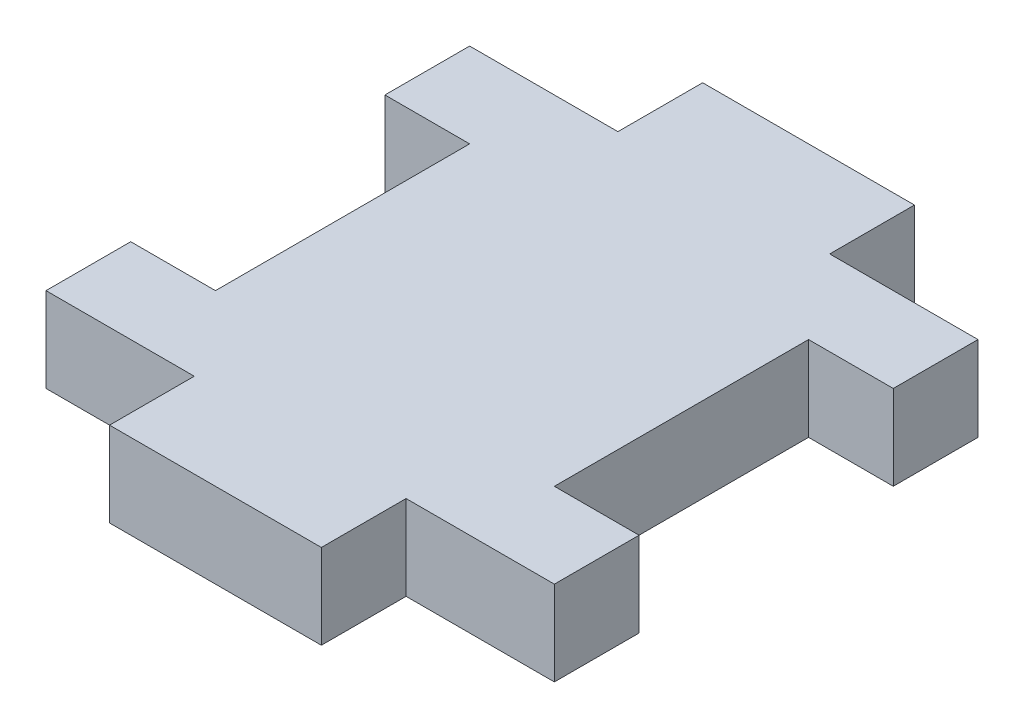
ISO-10303-21;
HEADER;
FILE_DESCRIPTION(('STEP AP214'),'2;1');
FILE_NAME('part.step','',(''),(''),'','','');
FILE_SCHEMA(('AUTOMOTIVE_DESIGN { 1 0 10303 214 1 1 1 1 }'));
ENDSEC;
DATA;
#1=APPLICATION_CONTEXT('core data for automotive mechanical design processes');
#2=APPLICATION_PROTOCOL_DEFINITION('international standard','automotive_design',2000,#1);
#3=PRODUCT_CONTEXT('',#1,'mechanical');
#4=PRODUCT('Part','Part','',(#3));
#5=PRODUCT_RELATED_PRODUCT_CATEGORY('part','',(#4));
#6=PRODUCT_DEFINITION_FORMATION('','',#4);
#7=PRODUCT_DEFINITION_CONTEXT('part definition',#1,'design');
#8=PRODUCT_DEFINITION('design','',#6,#7);
#9=PRODUCT_DEFINITION_SHAPE('','',#8);
#10=(LENGTH_UNIT() NAMED_UNIT(*) SI_UNIT(.MILLI.,.METRE.));
#11=(NAMED_UNIT(*) PLANE_ANGLE_UNIT() SI_UNIT($,.RADIAN.));
#12=(NAMED_UNIT(*) SI_UNIT($,.STERADIAN.) SOLID_ANGLE_UNIT());
#13=UNCERTAINTY_MEASURE_WITH_UNIT(LENGTH_MEASURE(1.E-05),#10,'distance_accuracy_value','');
#14=(GEOMETRIC_REPRESENTATION_CONTEXT(3) GLOBAL_UNCERTAINTY_ASSIGNED_CONTEXT((#13)) GLOBAL_UNIT_ASSIGNED_CONTEXT((#10,
#11,#12)) REPRESENTATION_CONTEXT('',''));
#15=CARTESIAN_POINT('',(0.,0.,0.));
#16=DIRECTION('',(0.,0.,1.));
#17=DIRECTION('',(1.,0.,0.));
#18=AXIS2_PLACEMENT_3D('',#15,#16,#17);
#19=CARTESIAN_POINT('',(-15.875,12.7,-31.75));
#20=DIRECTION('',(1.,0.,0.));
#21=DIRECTION('',(0.,0.,-1.));
#22=AXIS2_PLACEMENT_3D('',#19,#20,#21);
#23=PLANE('',#22);
#24=DIRECTION('',(0.,0.,1.));
#25=VECTOR('',#24,1.);
#26=CARTESIAN_POINT('',(-15.875,0.,-31.75));
#27=LINE('',#26,#25);
#28=CARTESIAN_POINT('',(-15.875,0.,-44.45));
#29=VERTEX_POINT('',#28);
#30=CARTESIAN_POINT('',(-15.875,0.,-31.75));
#31=VERTEX_POINT('',#30);
#32=EDGE_CURVE('E201',#29,#31,#27,.T.);
#33=ORIENTED_EDGE('',*,*,#32,.T.);
#34=DIRECTION('',(0.,-1.,0.));
#35=VECTOR('',#34,1.);
#36=CARTESIAN_POINT('',(-15.875,12.7,-31.75));
#37=LINE('',#36,#35);
#38=CARTESIAN_POINT('',(-15.875,12.7,-31.75));
#39=VERTEX_POINT('',#38);
#40=EDGE_CURVE('E11',#39,#31,#37,.T.);
#41=ORIENTED_EDGE('',*,*,#40,.F.);
#42=DIRECTION('',(0.,0.,1.));
#43=VECTOR('',#42,1.);
#44=CARTESIAN_POINT('',(-15.875,12.7,-31.75));
#45=LINE('',#44,#43);
#46=CARTESIAN_POINT('',(-15.875,12.7,-44.45));
#47=VERTEX_POINT('',#46);
#48=EDGE_CURVE('E239',#47,#39,#45,.T.);
#49=ORIENTED_EDGE('',*,*,#48,.F.);
#50=DIRECTION('',(0.,-1.,0.));
#51=VECTOR('',#50,1.);
#52=CARTESIAN_POINT('',(-15.875,12.7,-44.45));
#53=LINE('',#52,#51);
#54=EDGE_CURVE('E197',#47,#29,#53,.T.);
#55=ORIENTED_EDGE('',*,*,#54,.T.);
#56=EDGE_LOOP('',(#33,#41,#49,#55));
#57=FACE_BOUND('',#56,.T.);
#58=ADVANCED_FACE('F33',(#57),#23,.F.);
#59=CARTESIAN_POINT('',(-15.875,12.7,-31.75));
#60=DIRECTION('',(0.,0.,1.));
#61=DIRECTION('',(1.,0.,0.));
#62=AXIS2_PLACEMENT_3D('',#59,#60,#61);
#63=PLANE('',#62);
#64=DIRECTION('',(-1.,0.,0.));
#65=VECTOR('',#64,1.);
#66=CARTESIAN_POINT('',(-15.875,0.,-31.75));
#67=LINE('',#66,#65);
#68=CARTESIAN_POINT('',(-38.1,0.,-31.75));
#69=VERTEX_POINT('',#68);
#70=EDGE_CURVE('E204',#31,#69,#67,.T.);
#71=ORIENTED_EDGE('',*,*,#70,.T.);
#72=DIRECTION('',(0.,-1.,0.));
#73=VECTOR('',#72,1.);
#74=CARTESIAN_POINT('',(-38.1,12.7,-31.75));
#75=LINE('',#74,#73);
#76=CARTESIAN_POINT('',(-38.1,12.7,-31.75));
#77=VERTEX_POINT('',#76);
#78=EDGE_CURVE('E41',#77,#69,#75,.T.);
#79=ORIENTED_EDGE('',*,*,#78,.F.);
#80=DIRECTION('',(-1.,0.,0.));
#81=VECTOR('',#80,1.);
#82=CARTESIAN_POINT('',(-15.875,12.7,-31.75));
#83=LINE('',#82,#81);
#84=EDGE_CURVE('E128',#39,#77,#83,.T.);
#85=ORIENTED_EDGE('',*,*,#84,.F.);
#86=ORIENTED_EDGE('',*,*,#40,.T.);
#87=EDGE_LOOP('',(#71,#79,#85,#86));
#88=FACE_BOUND('',#87,.T.);
#89=ADVANCED_FACE('F357',(#88),#63,.F.);
#90=CARTESIAN_POINT('',(-38.1,12.7,-19.05));
#91=DIRECTION('',(1.,0.,0.));
#92=DIRECTION('',(0.,0.,-1.));
#93=AXIS2_PLACEMENT_3D('',#90,#91,#92);
#94=PLANE('',#93);
#95=DIRECTION('',(0.,0.,1.));
#96=VECTOR('',#95,1.);
#97=CARTESIAN_POINT('',(-38.1,0.,-19.05));
#98=LINE('',#97,#96);
#99=CARTESIAN_POINT('',(-38.1,0.,-19.05));
#100=VERTEX_POINT('',#99);
#101=EDGE_CURVE('E206',#69,#100,#98,.T.);
#102=ORIENTED_EDGE('',*,*,#101,.T.);
#103=DIRECTION('',(0.,-1.,0.));
#104=VECTOR('',#103,1.);
#105=CARTESIAN_POINT('',(-38.1,12.7,-19.05));
#106=LINE('',#105,#104);
#107=CARTESIAN_POINT('',(-38.1,12.7,-19.05));
#108=VERTEX_POINT('',#107);
#109=EDGE_CURVE('E282',#108,#100,#106,.T.);
#110=ORIENTED_EDGE('',*,*,#109,.F.);
#111=DIRECTION('',(0.,0.,1.));
#112=VECTOR('',#111,1.);
#113=CARTESIAN_POINT('',(-38.1,12.7,-19.05));
#114=LINE('',#113,#112);
#115=EDGE_CURVE('E290',#77,#108,#114,.T.);
#116=ORIENTED_EDGE('',*,*,#115,.F.);
#117=ORIENTED_EDGE('',*,*,#78,.T.);
#118=EDGE_LOOP('',(#102,#110,#116,#117));
#119=FACE_BOUND('',#118,.T.);
#120=ADVANCED_FACE('F288',(#119),#94,.F.);
#121=CARTESIAN_POINT('',(-38.1,12.7,-19.05));
#122=DIRECTION('',(0.,0.,-1.));
#123=DIRECTION('',(-1.,0.,0.));
#124=AXIS2_PLACEMENT_3D('',#121,#122,#123);
#125=PLANE('',#124);
#126=DIRECTION('',(1.,0.,0.));
#127=VECTOR('',#126,1.);
#128=CARTESIAN_POINT('',(-38.1,0.,-19.05));
#129=LINE('',#128,#127);
#130=CARTESIAN_POINT('',(-25.4,0.,-19.05));
#131=VERTEX_POINT('',#130);
#132=EDGE_CURVE('E208',#100,#131,#129,.T.);
#133=ORIENTED_EDGE('',*,*,#132,.T.);
#134=DIRECTION('',(0.,-1.,0.));
#135=VECTOR('',#134,1.);
#136=CARTESIAN_POINT('',(-25.4,12.7,-19.05));
#137=LINE('',#136,#135);
#138=CARTESIAN_POINT('',(-25.4,12.7,-19.05));
#139=VERTEX_POINT('',#138);
#140=EDGE_CURVE('E279',#139,#131,#137,.T.);
#141=ORIENTED_EDGE('',*,*,#140,.F.);
#142=DIRECTION('',(1.,0.,0.));
#143=VECTOR('',#142,1.);
#144=CARTESIAN_POINT('',(-38.1,12.7,-19.05));
#145=LINE('',#144,#143);
#146=EDGE_CURVE('E308',#108,#139,#145,.T.);
#147=ORIENTED_EDGE('',*,*,#146,.F.);
#148=ORIENTED_EDGE('',*,*,#109,.T.);
#149=EDGE_LOOP('',(#133,#141,#147,#148));
#150=FACE_BOUND('',#149,.T.);
#151=ADVANCED_FACE('F299',(#150),#125,.F.);
#152=CARTESIAN_POINT('',(-25.4,12.7,-19.05));
#153=DIRECTION('',(1.,0.,0.));
#154=DIRECTION('',(0.,0.,-1.));
#155=AXIS2_PLACEMENT_3D('',#152,#153,#154);
#156=PLANE('',#155);
#157=DIRECTION('',(0.,0.,1.));
#158=VECTOR('',#157,1.);
#159=CARTESIAN_POINT('',(-25.4,0.,-19.05));
#160=LINE('',#159,#158);
#161=CARTESIAN_POINT('',(-25.4,0.,19.05));
#162=VERTEX_POINT('',#161);
#163=EDGE_CURVE('E210',#131,#162,#160,.T.);
#164=ORIENTED_EDGE('',*,*,#163,.T.);
#165=DIRECTION('',(0.,-1.,0.));
#166=VECTOR('',#165,1.);
#167=CARTESIAN_POINT('',(-25.4,12.7,19.05));
#168=LINE('',#167,#166);
#169=CARTESIAN_POINT('',(-25.4,12.7,19.05));
#170=VERTEX_POINT('',#169);
#171=EDGE_CURVE('E276',#170,#162,#168,.T.);
#172=ORIENTED_EDGE('',*,*,#171,.F.);
#173=DIRECTION('',(0.,0.,1.));
#174=VECTOR('',#173,1.);
#175=CARTESIAN_POINT('',(-25.4,12.7,-19.05));
#176=LINE('',#175,#174);
#177=EDGE_CURVE('E305',#139,#170,#176,.T.);
#178=ORIENTED_EDGE('',*,*,#177,.F.);
#179=ORIENTED_EDGE('',*,*,#140,.T.);
#180=EDGE_LOOP('',(#164,#172,#178,#179));
#181=FACE_BOUND('',#180,.T.);
#182=ADVANCED_FACE('F303',(#181),#156,.F.);
#183=CARTESIAN_POINT('',(-25.4,12.7,19.05));
#184=DIRECTION('',(0.,0.,1.));
#185=DIRECTION('',(1.,0.,0.));
#186=AXIS2_PLACEMENT_3D('',#183,#184,#185);
#187=PLANE('',#186);
#188=DIRECTION('',(-1.,0.,0.));
#189=VECTOR('',#188,1.);
#190=CARTESIAN_POINT('',(-25.4,0.,19.05));
#191=LINE('',#190,#189);
#192=CARTESIAN_POINT('',(-38.1,0.,19.05));
#193=VERTEX_POINT('',#192);
#194=EDGE_CURVE('E212',#162,#193,#191,.T.);
#195=ORIENTED_EDGE('',*,*,#194,.T.);
#196=DIRECTION('',(0.,-1.,0.));
#197=VECTOR('',#196,1.);
#198=CARTESIAN_POINT('',(-38.1,12.7,19.05));
#199=LINE('',#198,#197);
#200=CARTESIAN_POINT('',(-38.1,12.7,19.05));
#201=VERTEX_POINT('',#200);
#202=EDGE_CURVE('E273',#201,#193,#199,.T.);
#203=ORIENTED_EDGE('',*,*,#202,.F.);
#204=DIRECTION('',(-1.,0.,0.));
#205=VECTOR('',#204,1.);
#206=CARTESIAN_POINT('',(-25.4,12.7,19.05));
#207=LINE('',#206,#205);
#208=EDGE_CURVE('E307',#170,#201,#207,.T.);
#209=ORIENTED_EDGE('',*,*,#208,.F.);
#210=ORIENTED_EDGE('',*,*,#171,.T.);
#211=EDGE_LOOP('',(#195,#203,#209,#210));
#212=FACE_BOUND('',#211,.T.);
#213=ADVANCED_FACE('F370',(#212),#187,.F.);
#214=CARTESIAN_POINT('',(-38.1,12.7,31.75));
#215=DIRECTION('',(1.,0.,0.));
#216=DIRECTION('',(0.,0.,-1.));
#217=AXIS2_PLACEMENT_3D('',#214,#215,#216);
#218=PLANE('',#217);
#219=DIRECTION('',(0.,0.,1.));
#220=VECTOR('',#219,1.);
#221=CARTESIAN_POINT('',(-38.1,0.,31.75));
#222=LINE('',#221,#220);
#223=CARTESIAN_POINT('',(-38.1,0.,31.75));
#224=VERTEX_POINT('',#223);
#225=EDGE_CURVE('E214',#193,#224,#222,.T.);
#226=ORIENTED_EDGE('',*,*,#225,.T.);
#227=DIRECTION('',(0.,-1.,0.));
#228=VECTOR('',#227,1.);
#229=CARTESIAN_POINT('',(-38.1,12.7,31.75));
#230=LINE('',#229,#228);
#231=CARTESIAN_POINT('',(-38.1,12.7,31.75));
#232=VERTEX_POINT('',#231);
#233=EDGE_CURVE('E270',#232,#224,#230,.T.);
#234=ORIENTED_EDGE('',*,*,#233,.F.);
#235=DIRECTION('',(0.,0.,1.));
#236=VECTOR('',#235,1.);
#237=CARTESIAN_POINT('',(-38.1,12.7,31.75));
#238=LINE('',#237,#236);
#239=EDGE_CURVE('E310',#201,#232,#238,.T.);
#240=ORIENTED_EDGE('',*,*,#239,.F.);
#241=ORIENTED_EDGE('',*,*,#202,.T.);
#242=EDGE_LOOP('',(#226,#234,#240,#241));
#243=FACE_BOUND('',#242,.T.);
#244=ADVANCED_FACE('F373',(#243),#218,.F.);
#245=CARTESIAN_POINT('',(-15.875,12.7,31.75));
#246=DIRECTION('',(0.,0.,-1.));
#247=DIRECTION('',(-1.,0.,0.));
#248=AXIS2_PLACEMENT_3D('',#245,#246,#247);
#249=PLANE('',#248);
#250=DIRECTION('',(1.,0.,0.));
#251=VECTOR('',#250,1.);
#252=CARTESIAN_POINT('',(-15.875,0.,31.75));
#253=LINE('',#252,#251);
#254=CARTESIAN_POINT('',(-15.875,0.,31.75));
#255=VERTEX_POINT('',#254);
#256=EDGE_CURVE('E216',#224,#255,#253,.T.);
#257=ORIENTED_EDGE('',*,*,#256,.T.);
#258=DIRECTION('',(0.,-1.,0.));
#259=VECTOR('',#258,1.);
#260=CARTESIAN_POINT('',(-15.875,12.7,31.75));
#261=LINE('',#260,#259);
#262=CARTESIAN_POINT('',(-15.875,12.7,31.75));
#263=VERTEX_POINT('',#262);
#264=EDGE_CURVE('E267',#263,#255,#261,.T.);
#265=ORIENTED_EDGE('',*,*,#264,.F.);
#266=DIRECTION('',(1.,0.,0.));
#267=VECTOR('',#266,1.);
#268=CARTESIAN_POINT('',(-15.875,12.7,31.75));
#269=LINE('',#268,#267);
#270=EDGE_CURVE('E316',#232,#263,#269,.T.);
#271=ORIENTED_EDGE('',*,*,#270,.F.);
#272=ORIENTED_EDGE('',*,*,#233,.T.);
#273=EDGE_LOOP('',(#257,#265,#271,#272));
#274=FACE_BOUND('',#273,.T.);
#275=ADVANCED_FACE('F377',(#274),#249,.F.);
#276=CARTESIAN_POINT('',(-15.875,12.7,44.45));
#277=DIRECTION('',(1.,0.,0.));
#278=DIRECTION('',(0.,0.,-1.));
#279=AXIS2_PLACEMENT_3D('',#276,#277,#278);
#280=PLANE('',#279);
#281=DIRECTION('',(0.,0.,1.));
#282=VECTOR('',#281,1.);
#283=CARTESIAN_POINT('',(-15.875,0.,44.45));
#284=LINE('',#283,#282);
#285=CARTESIAN_POINT('',(-15.875,0.,44.45));
#286=VERTEX_POINT('',#285);
#287=EDGE_CURVE('E218',#255,#286,#284,.T.);
#288=ORIENTED_EDGE('',*,*,#287,.T.);
#289=DIRECTION('',(0.,-1.,0.));
#290=VECTOR('',#289,1.);
#291=CARTESIAN_POINT('',(-15.875,12.7,44.45));
#292=LINE('',#291,#290);
#293=CARTESIAN_POINT('',(-15.875,12.7,44.45));
#294=VERTEX_POINT('',#293);
#295=EDGE_CURVE('E264',#294,#286,#292,.T.);
#296=ORIENTED_EDGE('',*,*,#295,.F.);
#297=DIRECTION('',(0.,0.,1.));
#298=VECTOR('',#297,1.);
#299=CARTESIAN_POINT('',(-15.875,12.7,44.45));
#300=LINE('',#299,#298);
#301=EDGE_CURVE('E318',#263,#294,#300,.T.);
#302=ORIENTED_EDGE('',*,*,#301,.F.);
#303=ORIENTED_EDGE('',*,*,#264,.T.);
#304=EDGE_LOOP('',(#288,#296,#302,#303));
#305=FACE_BOUND('',#304,.T.);
#306=ADVANCED_FACE('F381',(#305),#280,.F.);
#307=CARTESIAN_POINT('',(15.875,12.7,44.45));
#308=DIRECTION('',(0.,0.,-1.));
#309=DIRECTION('',(-1.,0.,0.));
#310=AXIS2_PLACEMENT_3D('',#307,#308,#309);
#311=PLANE('',#310);
#312=DIRECTION('',(1.,0.,0.));
#313=VECTOR('',#312,1.);
#314=CARTESIAN_POINT('',(15.875,0.,44.45));
#315=LINE('',#314,#313);
#316=CARTESIAN_POINT('',(15.875,0.,44.45));
#317=VERTEX_POINT('',#316);
#318=EDGE_CURVE('E220',#286,#317,#315,.T.);
#319=ORIENTED_EDGE('',*,*,#318,.T.);
#320=DIRECTION('',(0.,-1.,0.));
#321=VECTOR('',#320,1.);
#322=CARTESIAN_POINT('',(15.875,12.7,44.45));
#323=LINE('',#322,#321);
#324=CARTESIAN_POINT('',(15.875,12.7,44.45));
#325=VERTEX_POINT('',#324);
#326=EDGE_CURVE('E261',#325,#317,#323,.T.);
#327=ORIENTED_EDGE('',*,*,#326,.F.);
#328=DIRECTION('',(1.,0.,0.));
#329=VECTOR('',#328,1.);
#330=CARTESIAN_POINT('',(15.875,12.7,44.45));
#331=LINE('',#330,#329);
#332=EDGE_CURVE('E320',#294,#325,#331,.T.);
#333=ORIENTED_EDGE('',*,*,#332,.F.);
#334=ORIENTED_EDGE('',*,*,#295,.T.);
#335=EDGE_LOOP('',(#319,#327,#333,#334));
#336=FACE_BOUND('',#335,.T.);
#337=ADVANCED_FACE('F385',(#336),#311,.F.);
#338=CARTESIAN_POINT('',(15.875,12.7,44.45));
#339=DIRECTION('',(-1.,0.,0.));
#340=DIRECTION('',(0.,0.,1.));
#341=AXIS2_PLACEMENT_3D('',#338,#339,#340);
#342=PLANE('',#341);
#343=DIRECTION('',(0.,0.,-1.));
#344=VECTOR('',#343,1.);
#345=CARTESIAN_POINT('',(15.875,0.,44.45));
#346=LINE('',#345,#344);
#347=CARTESIAN_POINT('',(15.875,0.,31.75));
#348=VERTEX_POINT('',#347);
#349=EDGE_CURVE('E222',#317,#348,#346,.T.);
#350=ORIENTED_EDGE('',*,*,#349,.T.);
#351=DIRECTION('',(0.,-1.,0.));
#352=VECTOR('',#351,1.);
#353=CARTESIAN_POINT('',(15.875,12.7,31.75));
#354=LINE('',#353,#352);
#355=CARTESIAN_POINT('',(15.875,12.7,31.75));
#356=VERTEX_POINT('',#355);
#357=EDGE_CURVE('E258',#356,#348,#354,.T.);
#358=ORIENTED_EDGE('',*,*,#357,.F.);
#359=DIRECTION('',(0.,0.,-1.));
#360=VECTOR('',#359,1.);
#361=CARTESIAN_POINT('',(15.875,12.7,44.45));
#362=LINE('',#361,#360);
#363=EDGE_CURVE('E322',#325,#356,#362,.T.);
#364=ORIENTED_EDGE('',*,*,#363,.F.);
#365=ORIENTED_EDGE('',*,*,#326,.T.);
#366=EDGE_LOOP('',(#350,#358,#364,#365));
#367=FACE_BOUND('',#366,.T.);
#368=ADVANCED_FACE('F389',(#367),#342,.F.);
#369=CARTESIAN_POINT('',(38.1,12.7,31.75));
#370=DIRECTION('',(0.,0.,-1.));
#371=DIRECTION('',(-1.,0.,0.));
#372=AXIS2_PLACEMENT_3D('',#369,#370,#371);
#373=PLANE('',#372);
#374=DIRECTION('',(1.,0.,0.));
#375=VECTOR('',#374,1.);
#376=CARTESIAN_POINT('',(38.1,0.,31.75));
#377=LINE('',#376,#375);
#378=CARTESIAN_POINT('',(38.1,0.,31.75));
#379=VERTEX_POINT('',#378);
#380=EDGE_CURVE('E224',#348,#379,#377,.T.);
#381=ORIENTED_EDGE('',*,*,#380,.T.);
#382=DIRECTION('',(0.,-1.,0.));
#383=VECTOR('',#382,1.);
#384=CARTESIAN_POINT('',(38.1,12.7,31.75));
#385=LINE('',#384,#383);
#386=CARTESIAN_POINT('',(38.1,12.7,31.75));
#387=VERTEX_POINT('',#386);
#388=EDGE_CURVE('E255',#387,#379,#385,.T.);
#389=ORIENTED_EDGE('',*,*,#388,.F.);
#390=DIRECTION('',(1.,0.,0.));
#391=VECTOR('',#390,1.);
#392=CARTESIAN_POINT('',(38.1,12.7,31.75));
#393=LINE('',#392,#391);
#394=EDGE_CURVE('E324',#356,#387,#393,.T.);
#395=ORIENTED_EDGE('',*,*,#394,.F.);
#396=ORIENTED_EDGE('',*,*,#357,.T.);
#397=EDGE_LOOP('',(#381,#389,#395,#396));
#398=FACE_BOUND('',#397,.T.);
#399=ADVANCED_FACE('F393',(#398),#373,.F.);
#400=CARTESIAN_POINT('',(38.1,12.7,31.75));
#401=DIRECTION('',(-1.,0.,0.));
#402=DIRECTION('',(0.,0.,1.));
#403=AXIS2_PLACEMENT_3D('',#400,#401,#402);
#404=PLANE('',#403);
#405=DIRECTION('',(0.,0.,-1.));
#406=VECTOR('',#405,1.);
#407=CARTESIAN_POINT('',(38.1,0.,31.75));
#408=LINE('',#407,#406);
#409=CARTESIAN_POINT('',(38.1,0.,19.05));
#410=VERTEX_POINT('',#409);
#411=EDGE_CURVE('E226',#379,#410,#408,.T.);
#412=ORIENTED_EDGE('',*,*,#411,.T.);
#413=DIRECTION('',(0.,-1.,0.));
#414=VECTOR('',#413,1.);
#415=CARTESIAN_POINT('',(38.1,12.7,19.05));
#416=LINE('',#415,#414);
#417=CARTESIAN_POINT('',(38.1,12.7,19.05));
#418=VERTEX_POINT('',#417);
#419=EDGE_CURVE('E252',#418,#410,#416,.T.);
#420=ORIENTED_EDGE('',*,*,#419,.F.);
#421=DIRECTION('',(0.,0.,-1.));
#422=VECTOR('',#421,1.);
#423=CARTESIAN_POINT('',(38.1,12.7,31.75));
#424=LINE('',#423,#422);
#425=EDGE_CURVE('E326',#387,#418,#424,.T.);
#426=ORIENTED_EDGE('',*,*,#425,.F.);
#427=ORIENTED_EDGE('',*,*,#388,.T.);
#428=EDGE_LOOP('',(#412,#420,#426,#427));
#429=FACE_BOUND('',#428,.T.);
#430=ADVANCED_FACE('F397',(#429),#404,.F.);
#431=CARTESIAN_POINT('',(25.4,12.7,19.05));
#432=DIRECTION('',(0.,0.,1.));
#433=DIRECTION('',(1.,0.,0.));
#434=AXIS2_PLACEMENT_3D('',#431,#432,#433);
#435=PLANE('',#434);
#436=DIRECTION('',(-1.,0.,0.));
#437=VECTOR('',#436,1.);
#438=CARTESIAN_POINT('',(25.4,0.,19.05));
#439=LINE('',#438,#437);
#440=CARTESIAN_POINT('',(25.4,0.,19.05));
#441=VERTEX_POINT('',#440);
#442=EDGE_CURVE('E228',#410,#441,#439,.T.);
#443=ORIENTED_EDGE('',*,*,#442,.T.);
#444=DIRECTION('',(0.,-1.,0.));
#445=VECTOR('',#444,1.);
#446=CARTESIAN_POINT('',(25.4,12.7,19.05));
#447=LINE('',#446,#445);
#448=CARTESIAN_POINT('',(25.4,12.7,19.05));
#449=VERTEX_POINT('',#448);
#450=EDGE_CURVE('E249',#449,#441,#447,.T.);
#451=ORIENTED_EDGE('',*,*,#450,.F.);
#452=DIRECTION('',(-1.,0.,0.));
#453=VECTOR('',#452,1.);
#454=CARTESIAN_POINT('',(25.4,12.7,19.05));
#455=LINE('',#454,#453);
#456=EDGE_CURVE('E328',#418,#449,#455,.T.);
#457=ORIENTED_EDGE('',*,*,#456,.F.);
#458=ORIENTED_EDGE('',*,*,#419,.T.);
#459=EDGE_LOOP('',(#443,#451,#457,#458));
#460=FACE_BOUND('',#459,.T.);
#461=ADVANCED_FACE('F401',(#460),#435,.F.);
#462=CARTESIAN_POINT('',(25.4,12.7,-19.05));
#463=DIRECTION('',(-1.,0.,0.));
#464=DIRECTION('',(0.,0.,1.));
#465=AXIS2_PLACEMENT_3D('',#462,#463,#464);
#466=PLANE('',#465);
#467=DIRECTION('',(0.,0.,-1.));
#468=VECTOR('',#467,1.);
#469=CARTESIAN_POINT('',(25.4,0.,-19.05));
#470=LINE('',#469,#468);
#471=CARTESIAN_POINT('',(25.4,0.,-19.05));
#472=VERTEX_POINT('',#471);
#473=EDGE_CURVE('E230',#441,#472,#470,.T.);
#474=ORIENTED_EDGE('',*,*,#473,.T.);
#475=DIRECTION('',(0.,-1.,0.));
#476=VECTOR('',#475,1.);
#477=CARTESIAN_POINT('',(25.4,12.7,-19.05));
#478=LINE('',#477,#476);
#479=CARTESIAN_POINT('',(25.4,12.7,-19.05));
#480=VERTEX_POINT('',#479);
#481=EDGE_CURVE('E246',#480,#472,#478,.T.);
#482=ORIENTED_EDGE('',*,*,#481,.F.);
#483=DIRECTION('',(0.,0.,-1.));
#484=VECTOR('',#483,1.);
#485=CARTESIAN_POINT('',(25.4,12.7,-19.05));
#486=LINE('',#485,#484);
#487=EDGE_CURVE('E330',#449,#480,#486,.T.);
#488=ORIENTED_EDGE('',*,*,#487,.F.);
#489=ORIENTED_EDGE('',*,*,#450,.T.);
#490=EDGE_LOOP('',(#474,#482,#488,#489));
#491=FACE_BOUND('',#490,.T.);
#492=ADVANCED_FACE('F405',(#491),#466,.F.);
#493=CARTESIAN_POINT('',(38.1,12.7,-19.05));
#494=DIRECTION('',(0.,0.,-1.));
#495=DIRECTION('',(-1.,0.,0.));
#496=AXIS2_PLACEMENT_3D('',#493,#494,#495);
#497=PLANE('',#496);
#498=DIRECTION('',(1.,0.,0.));
#499=VECTOR('',#498,1.);
#500=CARTESIAN_POINT('',(38.1,0.,-19.05));
#501=LINE('',#500,#499);
#502=CARTESIAN_POINT('',(38.1,0.,-19.05));
#503=VERTEX_POINT('',#502);
#504=EDGE_CURVE('E232',#472,#503,#501,.T.);
#505=ORIENTED_EDGE('',*,*,#504,.T.);
#506=DIRECTION('',(0.,-1.,0.));
#507=VECTOR('',#506,1.);
#508=CARTESIAN_POINT('',(38.1,12.7,-19.05));
#509=LINE('',#508,#507);
#510=CARTESIAN_POINT('',(38.1,12.7,-19.05));
#511=VERTEX_POINT('',#510);
#512=EDGE_CURVE('E243',#511,#503,#509,.T.);
#513=ORIENTED_EDGE('',*,*,#512,.F.);
#514=DIRECTION('',(1.,0.,0.));
#515=VECTOR('',#514,1.);
#516=CARTESIAN_POINT('',(38.1,12.7,-19.05));
#517=LINE('',#516,#515);
#518=EDGE_CURVE('E332',#480,#511,#517,.T.);
#519=ORIENTED_EDGE('',*,*,#518,.F.);
#520=ORIENTED_EDGE('',*,*,#481,.T.);
#521=EDGE_LOOP('',(#505,#513,#519,#520));
#522=FACE_BOUND('',#521,.T.);
#523=ADVANCED_FACE('F338',(#522),#497,.F.);
#524=CARTESIAN_POINT('',(38.1,12.7,-19.05));
#525=DIRECTION('',(-1.,0.,0.));
#526=DIRECTION('',(0.,0.,1.));
#527=AXIS2_PLACEMENT_3D('',#524,#525,#526);
#528=PLANE('',#527);
#529=DIRECTION('',(0.,0.,-1.));
#530=VECTOR('',#529,1.);
#531=CARTESIAN_POINT('',(38.1,0.,-19.05));
#532=LINE('',#531,#530);
#533=CARTESIAN_POINT('',(38.1,0.,-31.75));
#534=VERTEX_POINT('',#533);
#535=EDGE_CURVE('E234',#503,#534,#532,.T.);
#536=ORIENTED_EDGE('',*,*,#535,.T.);
#537=DIRECTION('',(0.,-1.,0.));
#538=VECTOR('',#537,1.);
#539=CARTESIAN_POINT('',(38.1,12.7,-31.75));
#540=LINE('',#539,#538);
#541=CARTESIAN_POINT('',(38.1,12.7,-31.75));
#542=VERTEX_POINT('',#541);
#543=EDGE_CURVE('E192',#542,#534,#540,.T.);
#544=ORIENTED_EDGE('',*,*,#543,.F.);
#545=DIRECTION('',(0.,0.,-1.));
#546=VECTOR('',#545,1.);
#547=CARTESIAN_POINT('',(38.1,12.7,-19.05));
#548=LINE('',#547,#546);
#549=EDGE_CURVE('E183',#511,#542,#548,.T.);
#550=ORIENTED_EDGE('',*,*,#549,.F.);
#551=ORIENTED_EDGE('',*,*,#512,.T.);
#552=EDGE_LOOP('',(#536,#544,#550,#551));
#553=FACE_BOUND('',#552,.T.);
#554=ADVANCED_FACE('F342',(#553),#528,.F.);
#555=CARTESIAN_POINT('',(38.1,12.7,-31.75));
#556=DIRECTION('',(0.,0.,1.));
#557=DIRECTION('',(1.,0.,0.));
#558=AXIS2_PLACEMENT_3D('',#555,#556,#557);
#559=PLANE('',#558);
#560=DIRECTION('',(-1.,0.,0.));
#561=VECTOR('',#560,1.);
#562=CARTESIAN_POINT('',(38.1,0.,-31.75));
#563=LINE('',#562,#561);
#564=CARTESIAN_POINT('',(15.875,0.,-31.75));
#565=VERTEX_POINT('',#564);
#566=EDGE_CURVE('E191',#534,#565,#563,.T.);
#567=ORIENTED_EDGE('',*,*,#566,.T.);
#568=DIRECTION('',(0.,-1.,0.));
#569=VECTOR('',#568,1.);
#570=CARTESIAN_POINT('',(15.875,12.7,-31.75));
#571=LINE('',#570,#569);
#572=CARTESIAN_POINT('',(15.875,12.7,-31.75));
#573=VERTEX_POINT('',#572);
#574=EDGE_CURVE('E188',#573,#565,#571,.T.);
#575=ORIENTED_EDGE('',*,*,#574,.F.);
#576=DIRECTION('',(-1.,0.,0.));
#577=VECTOR('',#576,1.);
#578=CARTESIAN_POINT('',(38.1,12.7,-31.75));
#579=LINE('',#578,#577);
#580=EDGE_CURVE('E177',#542,#573,#579,.T.);
#581=ORIENTED_EDGE('',*,*,#580,.F.);
#582=ORIENTED_EDGE('',*,*,#543,.T.);
#583=EDGE_LOOP('',(#567,#575,#581,#582));
#584=FACE_BOUND('',#583,.T.);
#585=ADVANCED_FACE('F189',(#584),#559,.F.);
#586=CARTESIAN_POINT('',(15.875,12.7,-31.75));
#587=DIRECTION('',(-1.,0.,0.));
#588=DIRECTION('',(0.,0.,1.));
#589=AXIS2_PLACEMENT_3D('',#586,#587,#588);
#590=PLANE('',#589);
#591=DIRECTION('',(0.,0.,-1.));
#592=VECTOR('',#591,1.);
#593=CARTESIAN_POINT('',(15.875,0.,-31.75));
#594=LINE('',#593,#592);
#595=CARTESIAN_POINT('',(15.875,0.,-44.45));
#596=VERTEX_POINT('',#595);
#597=EDGE_CURVE('E114',#565,#596,#594,.T.);
#598=ORIENTED_EDGE('',*,*,#597,.T.);
#599=DIRECTION('',(0.,-1.,0.));
#600=VECTOR('',#599,1.);
#601=CARTESIAN_POINT('',(15.875,12.7,-44.45));
#602=LINE('',#601,#600);
#603=CARTESIAN_POINT('',(15.875,12.7,-44.45));
#604=VERTEX_POINT('',#603);
#605=EDGE_CURVE('E193',#604,#596,#602,.T.);
#606=ORIENTED_EDGE('',*,*,#605,.F.);
#607=DIRECTION('',(0.,0.,-1.));
#608=VECTOR('',#607,1.);
#609=CARTESIAN_POINT('',(15.875,12.7,-31.75));
#610=LINE('',#609,#608);
#611=EDGE_CURVE('E181',#573,#604,#610,.T.);
#612=ORIENTED_EDGE('',*,*,#611,.F.);
#613=ORIENTED_EDGE('',*,*,#574,.T.);
#614=EDGE_LOOP('',(#598,#606,#612,#613));
#615=FACE_BOUND('',#614,.T.);
#616=ADVANCED_FACE('F195',(#615),#590,.F.);
#617=CARTESIAN_POINT('',(15.875,12.7,-44.45));
#618=DIRECTION('',(0.,0.,1.));
#619=DIRECTION('',(1.,0.,0.));
#620=AXIS2_PLACEMENT_3D('',#617,#618,#619);
#621=PLANE('',#620);
#622=DIRECTION('',(-1.,0.,0.));
#623=VECTOR('',#622,1.);
#624=CARTESIAN_POINT('',(15.875,0.,-44.45));
#625=LINE('',#624,#623);
#626=EDGE_CURVE('E120',#596,#29,#625,.T.);
#627=ORIENTED_EDGE('',*,*,#626,.T.);
#628=ORIENTED_EDGE('',*,*,#54,.F.);
#629=DIRECTION('',(-1.,0.,0.));
#630=VECTOR('',#629,1.);
#631=CARTESIAN_POINT('',(15.875,12.7,-44.45));
#632=LINE('',#631,#630);
#633=EDGE_CURVE('E49',#604,#47,#632,.T.);
#634=ORIENTED_EDGE('',*,*,#633,.F.);
#635=ORIENTED_EDGE('',*,*,#605,.T.);
#636=EDGE_LOOP('',(#627,#628,#634,#635));
#637=FACE_BOUND('',#636,.T.);
#638=ADVANCED_FACE('F346',(#637),#621,.F.);
#639=CARTESIAN_POINT('',(0.,12.7,0.));
#640=DIRECTION('',(0.,1.,0.));
#641=DIRECTION('',(0.,0.,1.));
#642=AXIS2_PLACEMENT_3D('',#639,#640,#641);
#643=PLANE('',#642);
#644=ORIENTED_EDGE('',*,*,#48,.T.);
#645=ORIENTED_EDGE('',*,*,#84,.T.);
#646=ORIENTED_EDGE('',*,*,#115,.T.);
#647=ORIENTED_EDGE('',*,*,#146,.T.);
#648=ORIENTED_EDGE('',*,*,#177,.T.);
#649=ORIENTED_EDGE('',*,*,#208,.T.);
#650=ORIENTED_EDGE('',*,*,#239,.T.);
#651=ORIENTED_EDGE('',*,*,#270,.T.);
#652=ORIENTED_EDGE('',*,*,#301,.T.);
#653=ORIENTED_EDGE('',*,*,#332,.T.);
#654=ORIENTED_EDGE('',*,*,#363,.T.);
#655=ORIENTED_EDGE('',*,*,#394,.T.);
#656=ORIENTED_EDGE('',*,*,#425,.T.);
#657=ORIENTED_EDGE('',*,*,#456,.T.);
#658=ORIENTED_EDGE('',*,*,#487,.T.);
#659=ORIENTED_EDGE('',*,*,#518,.T.);
#660=ORIENTED_EDGE('',*,*,#549,.T.);
#661=ORIENTED_EDGE('',*,*,#580,.T.);
#662=ORIENTED_EDGE('',*,*,#611,.T.);
#663=ORIENTED_EDGE('',*,*,#633,.T.);
#664=EDGE_LOOP('',(#644,#645,#646,#647,#648,#649,#650,#651,#652,#653,#654,#655,#656,#657,#658,
#659,#660,#661,#662,#663));
#665=FACE_BOUND('',#664,.T.);
#666=ADVANCED_FACE('F179',(#665),#643,.T.);
#667=CARTESIAN_POINT('',(0.,0.,0.));
#668=DIRECTION('',(0.,1.,0.));
#669=DIRECTION('',(0.,0.,1.));
#670=AXIS2_PLACEMENT_3D('',#667,#668,#669);
#671=PLANE('',#670);
#672=ORIENTED_EDGE('',*,*,#32,.F.);
#673=ORIENTED_EDGE('',*,*,#626,.F.);
#674=ORIENTED_EDGE('',*,*,#597,.F.);
#675=ORIENTED_EDGE('',*,*,#566,.F.);
#676=ORIENTED_EDGE('',*,*,#535,.F.);
#677=ORIENTED_EDGE('',*,*,#504,.F.);
#678=ORIENTED_EDGE('',*,*,#473,.F.);
#679=ORIENTED_EDGE('',*,*,#442,.F.);
#680=ORIENTED_EDGE('',*,*,#411,.F.);
#681=ORIENTED_EDGE('',*,*,#380,.F.);
#682=ORIENTED_EDGE('',*,*,#349,.F.);
#683=ORIENTED_EDGE('',*,*,#318,.F.);
#684=ORIENTED_EDGE('',*,*,#287,.F.);
#685=ORIENTED_EDGE('',*,*,#256,.F.);
#686=ORIENTED_EDGE('',*,*,#225,.F.);
#687=ORIENTED_EDGE('',*,*,#194,.F.);
#688=ORIENTED_EDGE('',*,*,#163,.F.);
#689=ORIENTED_EDGE('',*,*,#132,.F.);
#690=ORIENTED_EDGE('',*,*,#101,.F.);
#691=ORIENTED_EDGE('',*,*,#70,.F.);
#692=EDGE_LOOP('',(#672,#673,#674,#675,#676,#677,#678,#679,#680,#681,#682,#683,#684,#685,#686,
#687,#688,#689,#690,#691));
#693=FACE_BOUND('',#692,.T.);
#694=ADVANCED_FACE('F294',(#693),#671,.F.);
#695=CLOSED_SHELL('',(#58,#89,#120,#151,#182,#213,#244,#275,#306,#337,#368,#399,#430,#461,#492,
#523,#554,#585,#616,#638,#666,#694));
#696=MANIFOLD_SOLID_BREP('B2',#695);
#697=ADVANCED_BREP_SHAPE_REPRESENTATION('',(#18,#696),#14);
#698=SHAPE_DEFINITION_REPRESENTATION(#9,#697);
ENDSEC;
END-ISO-10303-21;
